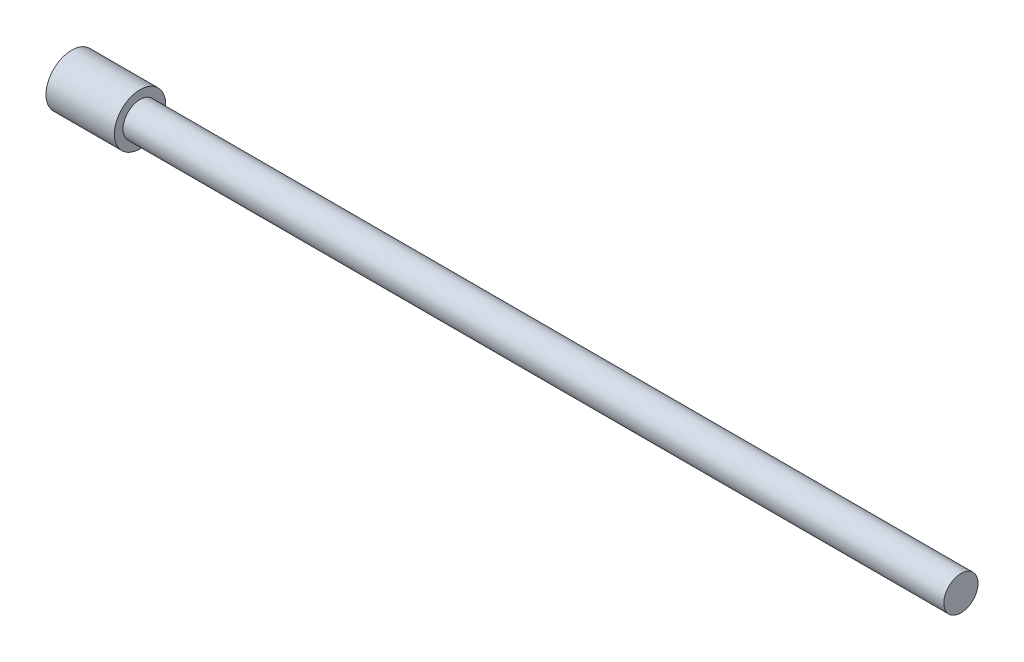
ISO-10303-21;
HEADER;
FILE_DESCRIPTION(('STEP AP214'),'2;1');
FILE_NAME('part.step','',(''),(''),'','','');
FILE_SCHEMA(('AUTOMOTIVE_DESIGN { 1 0 10303 214 1 1 1 1 }'));
ENDSEC;
DATA;
#1=APPLICATION_CONTEXT('core data for automotive mechanical design processes');
#2=APPLICATION_PROTOCOL_DEFINITION('international standard','automotive_design',2000,#1);
#3=PRODUCT_CONTEXT('',#1,'mechanical');
#4=PRODUCT('Part','Part','',(#3));
#5=PRODUCT_RELATED_PRODUCT_CATEGORY('part','',(#4));
#6=PRODUCT_DEFINITION_FORMATION('','',#4);
#7=PRODUCT_DEFINITION_CONTEXT('part definition',#1,'design');
#8=PRODUCT_DEFINITION('design','',#6,#7);
#9=PRODUCT_DEFINITION_SHAPE('','',#8);
#10=(LENGTH_UNIT() NAMED_UNIT(*) SI_UNIT(.MILLI.,.METRE.));
#11=(NAMED_UNIT(*) PLANE_ANGLE_UNIT() SI_UNIT($,.RADIAN.));
#12=(NAMED_UNIT(*) SI_UNIT($,.STERADIAN.) SOLID_ANGLE_UNIT());
#13=UNCERTAINTY_MEASURE_WITH_UNIT(LENGTH_MEASURE(1.E-05),#10,'distance_accuracy_value','');
#14=(GEOMETRIC_REPRESENTATION_CONTEXT(3) GLOBAL_UNCERTAINTY_ASSIGNED_CONTEXT((#13)) GLOBAL_UNIT_ASSIGNED_CONTEXT((#10,
#11,#12)) REPRESENTATION_CONTEXT('',''));
#15=CARTESIAN_POINT('',(0.,0.,0.));
#16=DIRECTION('',(0.,0.,1.));
#17=DIRECTION('',(1.,0.,0.));
#18=AXIS2_PLACEMENT_3D('',#15,#16,#17);
#19=CARTESIAN_POINT('',(152.4,0.,0.));
#20=DIRECTION('',(-1.,0.,0.));
#21=DIRECTION('',(0.,0.,1.));
#22=AXIS2_PLACEMENT_3D('',#19,#20,#21);
#23=CYLINDRICAL_SURFACE('',#22,6.35);
#24=CARTESIAN_POINT('',(152.4,0.,0.));
#25=DIRECTION('',(1.,0.,0.));
#26=DIRECTION('',(0.,0.,-1.));
#27=AXIS2_PLACEMENT_3D('',#24,#25,#26);
#28=CIRCLE('',#27,6.35);
#29=CARTESIAN_POINT('',(152.4,0.,6.35));
#30=VERTEX_POINT('',#29);
#31=EDGE_CURVE('E10',#30,#30,#28,.T.);
#32=CARTESIAN_POINT('',(-152.4,0.,0.));
#33=DIRECTION('',(1.,0.,0.));
#34=DIRECTION('',(0.,0.,-1.));
#35=AXIS2_PLACEMENT_3D('',#32,#33,#34);
#36=CIRCLE('',#35,6.35);
#37=CARTESIAN_POINT('',(-152.4,0.,6.35));
#38=VERTEX_POINT('',#37);
#39=EDGE_CURVE('E34',#38,#38,#36,.T.);
#40=CARTESIAN_POINT('',(152.4,0.,6.35));
#41=CARTESIAN_POINT('',(149.225,0.,6.35));
#42=CARTESIAN_POINT('',(146.05,0.,6.35));
#43=CARTESIAN_POINT('',(139.7,0.,6.35));
#44=CARTESIAN_POINT('',(136.525,0.,6.35));
#45=CARTESIAN_POINT('',(130.175,0.,6.35));
#46=CARTESIAN_POINT('',(127.,0.,6.35));
#47=CARTESIAN_POINT('',(120.65,0.,6.35));
#48=CARTESIAN_POINT('',(117.475,0.,6.35));
#49=CARTESIAN_POINT('',(111.125,0.,6.35));
#50=CARTESIAN_POINT('',(107.95,0.,6.35));
#51=CARTESIAN_POINT('',(101.6,0.,6.35));
#52=CARTESIAN_POINT('',(98.425,0.,6.35));
#53=CARTESIAN_POINT('',(92.075,0.,6.35));
#54=CARTESIAN_POINT('',(88.9,0.,6.35));
#55=CARTESIAN_POINT('',(82.55,0.,6.35));
#56=CARTESIAN_POINT('',(79.375,0.,6.35));
#57=CARTESIAN_POINT('',(73.025,0.,6.35));
#58=CARTESIAN_POINT('',(69.85,0.,6.35));
#59=CARTESIAN_POINT('',(63.5,0.,6.35));
#60=CARTESIAN_POINT('',(60.325,0.,6.35));
#61=CARTESIAN_POINT('',(53.975,0.,6.35));
#62=CARTESIAN_POINT('',(50.8,0.,6.35));
#63=CARTESIAN_POINT('',(44.45,0.,6.35));
#64=CARTESIAN_POINT('',(41.275,0.,6.35));
#65=CARTESIAN_POINT('',(34.925,0.,6.35));
#66=CARTESIAN_POINT('',(31.75,0.,6.35));
#67=CARTESIAN_POINT('',(25.4,0.,6.35));
#68=CARTESIAN_POINT('',(22.225,0.,6.35));
#69=CARTESIAN_POINT('',(15.875,0.,6.35));
#70=CARTESIAN_POINT('',(12.7,0.,6.35));
#71=CARTESIAN_POINT('',(6.35,0.,6.35));
#72=CARTESIAN_POINT('',(3.175,0.,6.35));
#73=CARTESIAN_POINT('',(-3.175,0.,6.35));
#74=CARTESIAN_POINT('',(-6.35,0.,6.35));
#75=CARTESIAN_POINT('',(-12.7,0.,6.35));
#76=CARTESIAN_POINT('',(-15.875,0.,6.35));
#77=CARTESIAN_POINT('',(-22.225,0.,6.35));
#78=CARTESIAN_POINT('',(-25.4,0.,6.35));
#79=CARTESIAN_POINT('',(-31.75,0.,6.35));
#80=CARTESIAN_POINT('',(-34.925,0.,6.35));
#81=CARTESIAN_POINT('',(-41.275,0.,6.35));
#82=CARTESIAN_POINT('',(-44.45,0.,6.35));
#83=CARTESIAN_POINT('',(-50.8,0.,6.35));
#84=CARTESIAN_POINT('',(-53.975,0.,6.35));
#85=CARTESIAN_POINT('',(-60.325,0.,6.35));
#86=CARTESIAN_POINT('',(-63.5,0.,6.35));
#87=CARTESIAN_POINT('',(-69.85,0.,6.35));
#88=CARTESIAN_POINT('',(-73.025,0.,6.35));
#89=CARTESIAN_POINT('',(-79.375,0.,6.35));
#90=CARTESIAN_POINT('',(-82.55,0.,6.35));
#91=CARTESIAN_POINT('',(-88.9,0.,6.35));
#92=CARTESIAN_POINT('',(-92.075,0.,6.35));
#93=CARTESIAN_POINT('',(-98.425,0.,6.35));
#94=CARTESIAN_POINT('',(-101.6,0.,6.35));
#95=CARTESIAN_POINT('',(-107.95,0.,6.35));
#96=CARTESIAN_POINT('',(-111.125,0.,6.35));
#97=CARTESIAN_POINT('',(-117.475,0.,6.35));
#98=CARTESIAN_POINT('',(-120.65,0.,6.35));
#99=CARTESIAN_POINT('',(-127.,0.,6.35));
#100=CARTESIAN_POINT('',(-130.175,0.,6.35));
#101=CARTESIAN_POINT('',(-136.525,0.,6.35));
#102=CARTESIAN_POINT('',(-139.7,0.,6.35));
#103=CARTESIAN_POINT('',(-146.05,0.,6.35));
#104=CARTESIAN_POINT('',(-149.225,0.,6.35));
#105=CARTESIAN_POINT('',(-152.4,0.,6.35));
#106=B_SPLINE_CURVE_WITH_KNOTS('',3,(#40,#41,#42,#43,#44,#45,#46,#47,#48,#49,#50,#51,#52,#53,
#54,#55,#56,#57,#58,#59,#60,#61,#62,#63,#64,#65,#66,#67,#68,#69,#70,#71,#72,#73,#74,#75,#76,#77,
#78,#79,#80,#81,#82,#83,#84,#85,#86,#87,#88,#89,#90,#91,#92,#93,#94,#95,#96,#97,#98,#99,#100,
#101,#102,#103,#104,#105),.UNSPECIFIED.,.F.,.F.,(4,2,2,2,2,2,2,2,2,2,2,2,2,2,2,2,2,2,2,2,2,2,2,
2,2,2,2,2,2,2,2,2,4),(0.,9.52500000000001,19.05,28.575,38.1,47.625,57.15,66.675,76.2,85.725,
95.25,104.775,114.3,123.825,133.35,142.875,152.4,161.925,171.45,180.975,190.5,200.025,209.55,
219.075,228.6,238.125,247.65,257.175,266.7,276.225,285.75,295.275,304.8),.UNSPECIFIED.);
#107=EDGE_CURVE('BSEAM31',#30,#38,#106,.T.);
#108=ORIENTED_EDGE('',*,*,#31,.F.);
#109=ORIENTED_EDGE('',*,*,#39,.T.);
#110=ORIENTED_EDGE('',*,*,#107,.T.);
#111=ORIENTED_EDGE('',*,*,#107,.F.);
#112=EDGE_LOOP('',(#108,#110,#109,#111));
#113=FACE_BOUND('',#112,.T.);
#114=ADVANCED_FACE('F31',(#113),#23,.T.);
#115=CARTESIAN_POINT('',(152.4,0.,0.));
#116=DIRECTION('',(1.,0.,0.));
#117=DIRECTION('',(0.,0.,-1.));
#118=AXIS2_PLACEMENT_3D('',#115,#116,#117);
#119=PLANE('',#118);
#120=ORIENTED_EDGE('',*,*,#31,.T.);
#121=EDGE_LOOP('',(#120));
#122=FACE_BOUND('',#121,.T.);
#123=ADVANCED_FACE('F54',(#122),#119,.T.);
#124=CARTESIAN_POINT('',(-177.8,0.,0.));
#125=DIRECTION('',(1.,0.,0.));
#126=DIRECTION('',(0.,0.,-1.));
#127=AXIS2_PLACEMENT_3D('',#124,#125,#126);
#128=CYLINDRICAL_SURFACE('',#127,9.525);
#129=CARTESIAN_POINT('',(-177.8,0.,0.));
#130=DIRECTION('',(-1.,0.,0.));
#131=DIRECTION('',(0.,0.,1.));
#132=AXIS2_PLACEMENT_3D('',#129,#130,#131);
#133=CIRCLE('',#132,9.525);
#134=CARTESIAN_POINT('',(-177.8,0.,9.525));
#135=VERTEX_POINT('',#134);
#136=EDGE_CURVE('E41',#135,#135,#133,.T.);
#137=ORIENTED_EDGE('',*,*,#136,.F.);
#138=EDGE_LOOP('',(#137));
#139=FACE_BOUND('',#138,.T.);
#140=CARTESIAN_POINT('',(-152.4,0.,0.));
#141=DIRECTION('',(-1.,0.,0.));
#142=DIRECTION('',(0.,0.,1.));
#143=AXIS2_PLACEMENT_3D('',#140,#141,#142);
#144=CIRCLE('',#143,9.525);
#145=CARTESIAN_POINT('',(-152.4,0.,9.525));
#146=VERTEX_POINT('',#145);
#147=EDGE_CURVE('E43',#146,#146,#144,.T.);
#148=ORIENTED_EDGE('',*,*,#147,.T.);
#149=EDGE_LOOP('',(#148));
#150=FACE_BOUND('',#149,.T.);
#151=ADVANCED_FACE('F51',(#139,#150),#128,.T.);
#152=CARTESIAN_POINT('',(-177.8,0.,0.));
#153=DIRECTION('',(-1.,0.,0.));
#154=DIRECTION('',(0.,0.,1.));
#155=AXIS2_PLACEMENT_3D('',#152,#153,#154);
#156=PLANE('',#155);
#157=ORIENTED_EDGE('',*,*,#136,.T.);
#158=EDGE_LOOP('',(#157));
#159=FACE_BOUND('',#158,.T.);
#160=ADVANCED_FACE('F49',(#159),#156,.T.);
#161=CARTESIAN_POINT('',(-152.4,0.,0.));
#162=DIRECTION('',(-1.,0.,0.));
#163=DIRECTION('',(0.,0.,1.));
#164=AXIS2_PLACEMENT_3D('',#161,#162,#163);
#165=PLANE('',#164);
#166=ORIENTED_EDGE('',*,*,#39,.F.);
#167=EDGE_LOOP('',(#166));
#168=FACE_BOUND('',#167,.T.);
#169=ORIENTED_EDGE('',*,*,#147,.F.);
#170=EDGE_LOOP('',(#169));
#171=FACE_BOUND('',#170,.T.);
#172=ADVANCED_FACE('F58',(#168,#171),#165,.F.);
#173=CLOSED_SHELL('',(#114,#123,#151,#160,#172));
#174=MANIFOLD_SOLID_BREP('B2',#173);
#175=ADVANCED_BREP_SHAPE_REPRESENTATION('',(#18,#174),#14);
#176=SHAPE_DEFINITION_REPRESENTATION(#9,#175);
ENDSEC;
END-ISO-10303-21;
